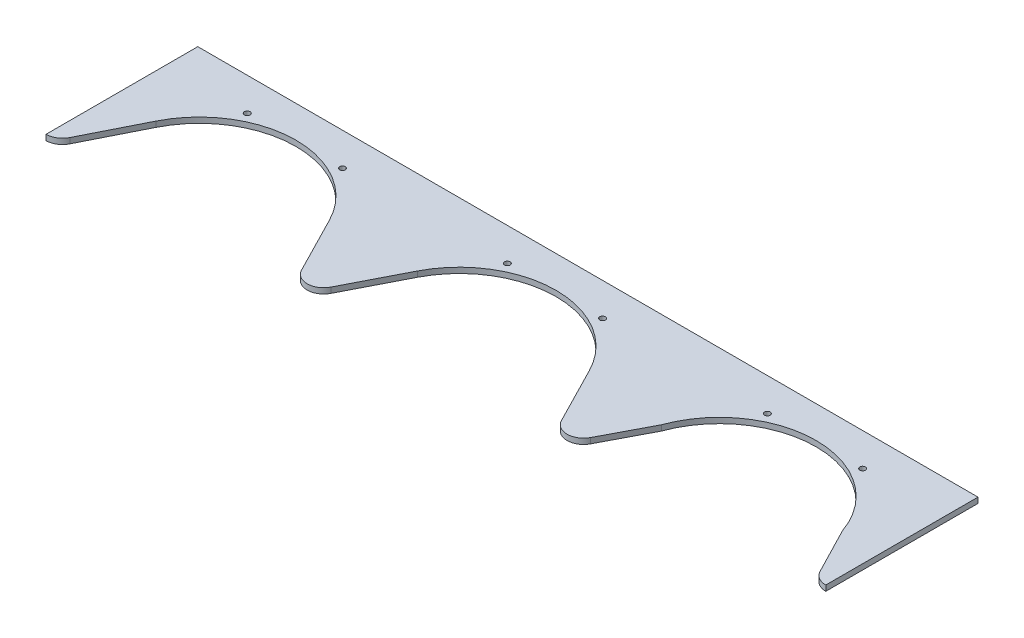
ISO-10303-21;
HEADER;
FILE_DESCRIPTION(('STEP AP214'),'2;1');
FILE_NAME('part.step','',(''),(''),'','','');
FILE_SCHEMA(('AUTOMOTIVE_DESIGN { 1 0 10303 214 1 1 1 1 }'));
ENDSEC;
DATA;
#1=APPLICATION_CONTEXT('core data for automotive mechanical design processes');
#2=APPLICATION_PROTOCOL_DEFINITION('international standard','automotive_design',2000,#1);
#3=PRODUCT_CONTEXT('',#1,'mechanical');
#4=PRODUCT('Part','Part','',(#3));
#5=PRODUCT_RELATED_PRODUCT_CATEGORY('part','',(#4));
#6=PRODUCT_DEFINITION_FORMATION('','',#4);
#7=PRODUCT_DEFINITION_CONTEXT('part definition',#1,'design');
#8=PRODUCT_DEFINITION('design','',#6,#7);
#9=PRODUCT_DEFINITION_SHAPE('','',#8);
#10=(LENGTH_UNIT() NAMED_UNIT(*) SI_UNIT(.MILLI.,.METRE.));
#11=(NAMED_UNIT(*) PLANE_ANGLE_UNIT() SI_UNIT($,.RADIAN.));
#12=(NAMED_UNIT(*) SI_UNIT($,.STERADIAN.) SOLID_ANGLE_UNIT());
#13=UNCERTAINTY_MEASURE_WITH_UNIT(LENGTH_MEASURE(1.E-05),#10,'distance_accuracy_value','');
#14=(GEOMETRIC_REPRESENTATION_CONTEXT(3) GLOBAL_UNCERTAINTY_ASSIGNED_CONTEXT((#13)) GLOBAL_UNIT_ASSIGNED_CONTEXT((#10,
#11,#12)) REPRESENTATION_CONTEXT('',''));
#15=CARTESIAN_POINT('',(0.,0.,0.));
#16=DIRECTION('',(0.,0.,1.));
#17=DIRECTION('',(1.,0.,0.));
#18=AXIS2_PLACEMENT_3D('',#15,#16,#17);
#19=CARTESIAN_POINT('',(-280.073238202378,-3.175,2.62205042113195));
#20=DIRECTION('',(-1.,0.,0.));
#21=DIRECTION('',(0.,0.,1.));
#22=AXIS2_PLACEMENT_3D('',#19,#20,#21);
#23=PLANE('',#22);
#24=DIRECTION('',(0.,0.,1.));
#25=VECTOR('',#24,1.);
#26=CARTESIAN_POINT('',(-280.073238202378,0.,2.62205042113195));
#27=LINE('',#26,#25);
#28=CARTESIAN_POINT('',(-280.073238202378,0.,-62.6015765640897));
#29=VERTEX_POINT('',#28);
#30=CARTESIAN_POINT('',(-280.073238202378,0.,25.1077984359102));
#31=VERTEX_POINT('',#30);
#32=EDGE_CURVE('E225',#29,#31,#27,.T.);
#33=ORIENTED_EDGE('',*,*,#32,.F.);
#34=DIRECTION('',(0.,1.,0.));
#35=VECTOR('',#34,1.);
#36=CARTESIAN_POINT('',(-280.073238202378,-3.175,-62.6015765640897));
#37=LINE('',#36,#35);
#38=CARTESIAN_POINT('',(-280.073238202378,-3.175,-62.6015765640897));
#39=VERTEX_POINT('',#38);
#40=EDGE_CURVE('E171',#39,#29,#37,.T.);
#41=ORIENTED_EDGE('',*,*,#40,.F.);
#42=DIRECTION('',(0.,0.,1.));
#43=VECTOR('',#42,1.);
#44=CARTESIAN_POINT('',(-280.073238202378,-3.175,2.62205042113195));
#45=LINE('',#44,#43);
#46=CARTESIAN_POINT('',(-280.073238202378,-3.175,25.1077984359102));
#47=VERTEX_POINT('',#46);
#48=EDGE_CURVE('E166',#39,#47,#45,.T.);
#49=ORIENTED_EDGE('',*,*,#48,.T.);
#50=DIRECTION('',(0.,1.,0.));
#51=VECTOR('',#50,1.);
#52=CARTESIAN_POINT('',(-280.073238202378,-3.175,25.1077984359102));
#53=LINE('',#52,#51);
#54=EDGE_CURVE('E148',#47,#31,#53,.T.);
#55=ORIENTED_EDGE('',*,*,#54,.T.);
#56=EDGE_LOOP('',(#33,#41,#49,#55));
#57=FACE_BOUND('',#56,.T.);
#58=ADVANCED_FACE('F35',(#57),#23,.T.);
#59=CARTESIAN_POINT('',(-427.444683767428,-3.175,-62.6015765640897));
#60=DIRECTION('',(0.,0.,1.));
#61=DIRECTION('',(1.,0.,0.));
#62=AXIS2_PLACEMENT_3D('',#59,#60,#61);
#63=PLANE('',#62);
#64=DIRECTION('',(1.,0.,0.));
#65=VECTOR('',#64,1.);
#66=CARTESIAN_POINT('',(-427.444683767428,0.,-62.6015765640897));
#67=LINE('',#66,#65);
#68=CARTESIAN_POINT('',(170.776761797622,0.,-62.6015765640897));
#69=VERTEX_POINT('',#68);
#70=EDGE_CURVE('E259',#29,#69,#67,.T.);
#71=ORIENTED_EDGE('',*,*,#70,.T.);
#72=DIRECTION('',(0.,1.,0.));
#73=VECTOR('',#72,1.);
#74=CARTESIAN_POINT('',(170.776761797622,-3.175,-62.6015765640897));
#75=LINE('',#74,#73);
#76=CARTESIAN_POINT('',(170.776761797622,-3.175,-62.6015765640897));
#77=VERTEX_POINT('',#76);
#78=EDGE_CURVE('E276',#77,#69,#75,.T.);
#79=ORIENTED_EDGE('',*,*,#78,.F.);
#80=DIRECTION('',(1.,0.,0.));
#81=VECTOR('',#80,1.);
#82=CARTESIAN_POINT('',(-427.444683767428,-3.175,-62.6015765640897));
#83=LINE('',#82,#81);
#84=EDGE_CURVE('E206',#39,#77,#83,.T.);
#85=ORIENTED_EDGE('',*,*,#84,.F.);
#86=ORIENTED_EDGE('',*,*,#40,.T.);
#87=EDGE_LOOP('',(#71,#79,#85,#86));
#88=FACE_BOUND('',#87,.T.);
#89=ADVANCED_FACE('F328',(#88),#63,.F.);
#90=CARTESIAN_POINT('',(170.776761797622,-3.175,2.62205042113195));
#91=DIRECTION('',(-1.,0.,0.));
#92=DIRECTION('',(0.,0.,1.));
#93=AXIS2_PLACEMENT_3D('',#90,#91,#92);
#94=PLANE('',#93);
#95=DIRECTION('',(0.,0.,1.));
#96=VECTOR('',#95,1.);
#97=CARTESIAN_POINT('',(170.776761797622,0.,2.62205042113195));
#98=LINE('',#97,#96);
#99=CARTESIAN_POINT('',(170.776761797622,0.,25.3727717752158));
#100=VERTEX_POINT('',#99);
#101=EDGE_CURVE('E256',#69,#100,#98,.T.);
#102=ORIENTED_EDGE('',*,*,#101,.T.);
#103=DIRECTION('',(0.,1.,0.));
#104=VECTOR('',#103,1.);
#105=CARTESIAN_POINT('',(170.776761797622,-3.175,25.3727717752158));
#106=LINE('',#105,#104);
#107=CARTESIAN_POINT('',(170.776761797622,-3.175,25.3727717752158));
#108=VERTEX_POINT('',#107);
#109=EDGE_CURVE('E279',#108,#100,#106,.T.);
#110=ORIENTED_EDGE('',*,*,#109,.F.);
#111=DIRECTION('',(0.,0.,1.));
#112=VECTOR('',#111,1.);
#113=CARTESIAN_POINT('',(170.776761797622,-3.175,2.62205042113195));
#114=LINE('',#113,#112);
#115=EDGE_CURVE('E204',#77,#108,#114,.T.);
#116=ORIENTED_EDGE('',*,*,#115,.F.);
#117=ORIENTED_EDGE('',*,*,#78,.T.);
#118=EDGE_LOOP('',(#102,#110,#116,#117));
#119=FACE_BOUND('',#118,.T.);
#120=ADVANCED_FACE('F333',(#119),#94,.F.);
#121=CARTESIAN_POINT('',(170.776761797622,-3.175,15.8477717752158));
#122=DIRECTION('',(0.,1.,0.));
#123=DIRECTION('',(0.,0.,1.));
#124=AXIS2_PLACEMENT_3D('',#121,#122,#123);
#125=CYLINDRICAL_SURFACE('',#124,9.525);
#126=CARTESIAN_POINT('',(170.776761797622,0.,15.8477717752158));
#127=DIRECTION('',(0.,1.,0.));
#128=DIRECTION('',(0.,0.,1.));
#129=AXIS2_PLACEMENT_3D('',#126,#127,#128);
#130=CIRCLE('',#129,9.525);
#131=CARTESIAN_POINT('',(162.31442899308,0.,20.2197905886681));
#132=VERTEX_POINT('',#131);
#133=EDGE_CURVE('E253',#132,#100,#130,.T.);
#134=ORIENTED_EDGE('',*,*,#133,.F.);
#135=DIRECTION('',(0.,1.,0.));
#136=VECTOR('',#135,1.);
#137=CARTESIAN_POINT('',(162.31442899308,-3.175,20.2197905886681));
#138=LINE('',#137,#136);
#139=CARTESIAN_POINT('',(162.31442899308,-3.175,20.2197905886681));
#140=VERTEX_POINT('',#139);
#141=EDGE_CURVE('E281',#140,#132,#138,.T.);
#142=ORIENTED_EDGE('',*,*,#141,.F.);
#143=CARTESIAN_POINT('',(170.776761797622,-3.175,15.8477717752158));
#144=DIRECTION('',(0.,1.,0.));
#145=DIRECTION('',(0.,0.,1.));
#146=AXIS2_PLACEMENT_3D('',#143,#144,#145);
#147=CIRCLE('',#146,9.525);
#148=EDGE_CURVE('E201',#140,#108,#147,.T.);
#149=ORIENTED_EDGE('',*,*,#148,.T.);
#150=ORIENTED_EDGE('',*,*,#109,.T.);
#151=EDGE_LOOP('',(#134,#142,#149,#150));
#152=FACE_BOUND('',#151,.T.);
#153=ADVANCED_FACE('F336',(#152),#125,.T.);
#154=CARTESIAN_POINT('',(30.8846242832344,-3.175,-234.171326043415));
#155=DIRECTION('',(-0.888433890240576,0.,0.459004599837514));
#156=DIRECTION('',(0.459004599837514,0.,0.888433890240576));
#157=AXIS2_PLACEMENT_3D('',#154,#155,#156);
#158=PLANE('',#157);
#159=DIRECTION('',(0.459004599837514,0.,0.888433890240576));
#160=VECTOR('',#159,1.);
#161=CARTESIAN_POINT('',(30.8846242832344,0.,-234.171326043415));
#162=LINE('',#161,#160);
#163=CARTESIAN_POINT('',(148.390090675422,0.,-6.73169108485386));
#164=VERTEX_POINT('',#163);
#165=EDGE_CURVE('E250',#164,#132,#162,.T.);
#166=ORIENTED_EDGE('',*,*,#165,.F.);
#167=DIRECTION('',(0.,1.,0.));
#168=VECTOR('',#167,1.);
#169=CARTESIAN_POINT('',(148.390090675422,-3.175,-6.73169108485386));
#170=LINE('',#169,#168);
#171=CARTESIAN_POINT('',(148.390090675422,-3.175,-6.73169108485386));
#172=VERTEX_POINT('',#171);
#173=EDGE_CURVE('E283',#172,#164,#170,.T.);
#174=ORIENTED_EDGE('',*,*,#173,.F.);
#175=DIRECTION('',(0.459004599837514,0.,0.888433890240576));
#176=VECTOR('',#175,1.);
#177=CARTESIAN_POINT('',(30.8846242832344,-3.175,-234.171326043415));
#178=LINE('',#177,#176);
#179=EDGE_CURVE('E198',#172,#140,#178,.T.);
#180=ORIENTED_EDGE('',*,*,#179,.T.);
#181=ORIENTED_EDGE('',*,*,#141,.T.);
#182=EDGE_LOOP('',(#166,#174,#180,#181));
#183=FACE_BOUND('',#182,.T.);
#184=ADVANCED_FACE('F339',(#183),#158,.T.);
#185=CARTESIAN_POINT('',(95.6350951309553,-3.175,11.6934234359103));
#186=DIRECTION('',(0.,1.,0.));
#187=DIRECTION('',(0.,0.,1.));
#188=AXIS2_PLACEMENT_3D('',#185,#186,#187);
#189=CYLINDRICAL_SURFACE('',#188,55.88);
#190=CARTESIAN_POINT('',(95.6350951309553,0.,11.6934234359103));
#191=DIRECTION('',(0.,1.,0.));
#192=DIRECTION('',(0.,0.,1.));
#193=AXIS2_PLACEMENT_3D('',#190,#191,#192);
#194=CIRCLE('',#193,55.88);
#195=CARTESIAN_POINT('',(43.0891381967172,0.,-7.31964601289768));
#196=VERTEX_POINT('',#195);
#197=EDGE_CURVE('E247',#164,#196,#194,.T.);
#198=ORIENTED_EDGE('',*,*,#197,.T.);
#199=DIRECTION('',(0.,1.,0.));
#200=VECTOR('',#199,1.);
#201=CARTESIAN_POINT('',(43.0891381967172,-3.175,-7.31964601289768));
#202=LINE('',#201,#200);
#203=CARTESIAN_POINT('',(43.0891381967172,-3.175,-7.31964601289768));
#204=VERTEX_POINT('',#203);
#205=EDGE_CURVE('E285',#204,#196,#202,.T.);
#206=ORIENTED_EDGE('',*,*,#205,.F.);
#207=CARTESIAN_POINT('',(95.6350951309553,-3.175,11.6934234359103));
#208=DIRECTION('',(0.,1.,0.));
#209=DIRECTION('',(0.,0.,1.));
#210=AXIS2_PLACEMENT_3D('',#207,#208,#209);
#211=CIRCLE('',#210,55.88);
#212=EDGE_CURVE('E195',#172,#204,#211,.T.);
#213=ORIENTED_EDGE('',*,*,#212,.F.);
#214=ORIENTED_EDGE('',*,*,#173,.T.);
#215=EDGE_LOOP('',(#198,#206,#213,#214));
#216=FACE_BOUND('',#215,.T.);
#217=ADVANCED_FACE('F344',(#216),#189,.F.);
#218=CARTESIAN_POINT('',(-62.2826144303275,-3.175,193.871681693301));
#219=DIRECTION('',(0.885857198551275,0.,0.463957997856365));
#220=DIRECTION('',(0.463957997856365,0.,-0.885857198551275));
#221=AXIS2_PLACEMENT_3D('',#218,#219,#220);
#222=PLANE('',#221);
#223=DIRECTION('',(0.463957997856365,0.,-0.885857198551276));
#224=VECTOR('',#223,1.);
#225=CARTESIAN_POINT('',(-62.2826144303275,0.,193.871681693301));
#226=LINE('',#225,#224);
#227=CARTESIAN_POINT('',(29.0256455147359,0.,19.532453286322));
#228=VERTEX_POINT('',#227);
#229=EDGE_CURVE('E245',#228,#196,#226,.T.);
#230=ORIENTED_EDGE('',*,*,#229,.F.);
#231=DIRECTION('',(0.,1.,0.));
#232=VECTOR('',#231,1.);
#233=CARTESIAN_POINT('',(29.0256455147359,-3.175,19.5324532863221));
#234=LINE('',#233,#232);
#235=CARTESIAN_POINT('',(29.0256455147359,-3.175,19.532453286322));
#236=VERTEX_POINT('',#235);
#237=EDGE_CURVE('E305',#228,#236,#234,.F.);
#238=ORIENTED_EDGE('',*,*,#237,.T.);
#239=DIRECTION('',(0.463957997856365,0.,-0.885857198551276));
#240=VECTOR('',#239,1.);
#241=CARTESIAN_POINT('',(-62.2826144303275,-3.175,193.871681693301));
#242=LINE('',#241,#240);
#243=EDGE_CURVE('E193',#236,#204,#242,.T.);
#244=ORIENTED_EDGE('',*,*,#243,.T.);
#245=ORIENTED_EDGE('',*,*,#205,.T.);
#246=EDGE_LOOP('',(#230,#238,#244,#245));
#247=FACE_BOUND('',#246,.T.);
#248=ADVANCED_FACE('F348',(#247),#222,.T.);
#249=CARTESIAN_POINT('',(-86.0632836712445,-3.175,-172.224546601413));
#250=DIRECTION('',(-0.890051077492998,0.,0.455860811491351));
#251=DIRECTION('',(0.455860811491351,0.,0.890051077492998));
#252=AXIS2_PLACEMENT_3D('',#249,#250,#251);
#253=PLANE('',#252);
#254=DIRECTION('',(0.455860811491351,0.,0.890051077492998));
#255=VECTOR('',#254,1.);
#256=CARTESIAN_POINT('',(-86.0632836712445,-3.175,-172.224546601413));
#257=LINE('',#256,#255);
#258=CARTESIAN_POINT('',(-4.9121839920693,-3.175,-13.7800787102265));
#259=VERTEX_POINT('',#258);
#260=CARTESIAN_POINT('',(12.1101191854142,-3.175,19.4553275861954));
#261=VERTEX_POINT('',#260);
#262=EDGE_CURVE('E190',#259,#261,#257,.T.);
#263=ORIENTED_EDGE('',*,*,#262,.T.);
#264=DIRECTION('',(0.,1.,0.));
#265=VECTOR('',#264,1.);
#266=CARTESIAN_POINT('',(12.1101191854142,-3.175,19.4553275861954));
#267=LINE('',#266,#265);
#268=CARTESIAN_POINT('',(12.1101191854142,0.,19.4553275861954));
#269=VERTEX_POINT('',#268);
#270=EDGE_CURVE('E275',#261,#269,#267,.T.);
#271=ORIENTED_EDGE('',*,*,#270,.T.);
#272=DIRECTION('',(0.455860811491351,0.,0.890051077492998));
#273=VECTOR('',#272,1.);
#274=CARTESIAN_POINT('',(-86.0632836712445,0.,-172.224546601413));
#275=LINE('',#274,#273);
#276=CARTESIAN_POINT('',(-4.9121839920693,0.,-13.7800787102265));
#277=VERTEX_POINT('',#276);
#278=EDGE_CURVE('E242',#277,#269,#275,.T.);
#279=ORIENTED_EDGE('',*,*,#278,.F.);
#280=DIRECTION('',(0.,1.,0.));
#281=VECTOR('',#280,1.);
#282=CARTESIAN_POINT('',(-4.9121839920693,-3.175,-13.7800787102265));
#283=LINE('',#282,#281);
#284=EDGE_CURVE('E288',#259,#277,#283,.T.);
#285=ORIENTED_EDGE('',*,*,#284,.F.);
#286=EDGE_LOOP('',(#263,#271,#279,#285));
#287=FACE_BOUND('',#286,.T.);
#288=ADVANCED_FACE('F355',(#287),#253,.T.);
#289=CARTESIAN_POINT('',(-54.6482382023781,-3.175,11.6934234359103));
#290=DIRECTION('',(0.,1.,0.));
#291=DIRECTION('',(0.,0.,1.));
#292=AXIS2_PLACEMENT_3D('',#289,#290,#291);
#293=CYLINDRICAL_SURFACE('',#292,55.88);
#294=CARTESIAN_POINT('',(-54.6482382023781,0.,11.6934234359103));
#295=DIRECTION('',(0.,1.,0.));
#296=DIRECTION('',(0.,0.,1.));
#297=AXIS2_PLACEMENT_3D('',#294,#295,#296);
#298=CIRCLE('',#297,55.88);
#299=CARTESIAN_POINT('',(-104.384292412687,0.,-13.7800787102265));
#300=VERTEX_POINT('',#299);
#301=EDGE_CURVE('E239',#277,#300,#298,.T.);
#302=ORIENTED_EDGE('',*,*,#301,.T.);
#303=DIRECTION('',(0.,1.,0.));
#304=VECTOR('',#303,1.);
#305=CARTESIAN_POINT('',(-104.384292412687,-3.175,-13.7800787102265));
#306=LINE('',#305,#304);
#307=CARTESIAN_POINT('',(-104.384292412687,-3.175,-13.7800787102265));
#308=VERTEX_POINT('',#307);
#309=EDGE_CURVE('E290',#308,#300,#306,.T.);
#310=ORIENTED_EDGE('',*,*,#309,.F.);
#311=CARTESIAN_POINT('',(-54.6482382023781,-3.175,11.6934234359103));
#312=DIRECTION('',(0.,1.,0.));
#313=DIRECTION('',(0.,0.,1.));
#314=AXIS2_PLACEMENT_3D('',#311,#312,#313);
#315=CIRCLE('',#314,55.88);
#316=EDGE_CURVE('E187',#259,#308,#315,.T.);
#317=ORIENTED_EDGE('',*,*,#316,.F.);
#318=ORIENTED_EDGE('',*,*,#284,.T.);
#319=EDGE_LOOP('',(#302,#310,#317,#318));
#320=FACE_BOUND('',#319,.T.);
#321=ADVANCED_FACE('F361',(#320),#293,.F.);
#322=CARTESIAN_POINT('',(-178.174165086371,-3.175,130.291870502565));
#323=DIRECTION('',(0.890051077492997,0.,0.455860811491352));
#324=DIRECTION('',(0.455860811491352,0.,-0.890051077492997));
#325=AXIS2_PLACEMENT_3D('',#322,#323,#324);
#326=PLANE('',#325);
#327=DIRECTION('',(0.455860811491352,0.,-0.890051077492997));
#328=VECTOR('',#327,1.);
#329=CARTESIAN_POINT('',(-178.174165086371,0.,130.291870502565));
#330=LINE('',#329,#328);
#331=CARTESIAN_POINT('',(-121.312168355924,0.,19.2709619652273));
#332=VERTEX_POINT('',#331);
#333=EDGE_CURVE('E237',#332,#300,#330,.T.);
#334=ORIENTED_EDGE('',*,*,#333,.F.);
#335=DIRECTION('',(0.,1.,0.));
#336=VECTOR('',#335,1.);
#337=CARTESIAN_POINT('',(-121.312168355924,-3.175,19.2709619652274));
#338=LINE('',#337,#336);
#339=CARTESIAN_POINT('',(-121.312168355924,-3.175,19.2709619652273));
#340=VERTEX_POINT('',#339);
#341=EDGE_CURVE('E11',#332,#340,#338,.F.);
#342=ORIENTED_EDGE('',*,*,#341,.T.);
#343=DIRECTION('',(0.455860811491352,0.,-0.890051077492997));
#344=VECTOR('',#343,1.);
#345=CARTESIAN_POINT('',(-178.174165086371,-3.175,130.291870502565));
#346=LINE('',#345,#344);
#347=EDGE_CURVE('E185',#340,#308,#346,.T.);
#348=ORIENTED_EDGE('',*,*,#347,.T.);
#349=ORIENTED_EDGE('',*,*,#309,.T.);
#350=EDGE_LOOP('',(#334,#342,#348,#349));
#351=FACE_BOUND('',#350,.T.);
#352=ADVANCED_FACE('F430',(#351),#326,.T.);
#353=CARTESIAN_POINT('',(-205.116375847367,-3.175,-111.248676134711));
#354=DIRECTION('',(-0.890051077492998,0.,0.455860811491352));
#355=DIRECTION('',(0.455860811491352,0.,0.890051077492998));
#356=AXIS2_PLACEMENT_3D('',#353,#354,#355);
#357=PLANE('',#356);
#358=DIRECTION('',(0.455860811491352,0.,0.890051077492998));
#359=VECTOR('',#358,1.);
#360=CARTESIAN_POINT('',(-205.116375847367,-3.175,-111.248676134711));
#361=LINE('',#360,#359);
#362=CARTESIAN_POINT('',(-155.195517325403,-3.175,-13.7800787102264));
#363=VERTEX_POINT('',#362);
#364=CARTESIAN_POINT('',(-138.267641382166,-3.175,19.2709619652273));
#365=VERTEX_POINT('',#364);
#366=EDGE_CURVE('E183',#363,#365,#361,.T.);
#367=ORIENTED_EDGE('',*,*,#366,.T.);
#368=DIRECTION('',(0.,1.,0.));
#369=VECTOR('',#368,1.);
#370=CARTESIAN_POINT('',(-138.267641382166,-3.175,19.2709619652273));
#371=LINE('',#370,#369);
#372=CARTESIAN_POINT('',(-138.267641382166,0.,19.2709619652273));
#373=VERTEX_POINT('',#372);
#374=EDGE_CURVE('E43',#365,#373,#371,.T.);
#375=ORIENTED_EDGE('',*,*,#374,.T.);
#376=DIRECTION('',(0.455860811491352,0.,0.890051077492998));
#377=VECTOR('',#376,1.);
#378=CARTESIAN_POINT('',(-205.116375847367,0.,-111.248676134711));
#379=LINE('',#378,#377);
#380=CARTESIAN_POINT('',(-155.195517325403,0.,-13.7800787102264));
#381=VERTEX_POINT('',#380);
#382=EDGE_CURVE('E234',#381,#373,#379,.T.);
#383=ORIENTED_EDGE('',*,*,#382,.F.);
#384=DIRECTION('',(0.,1.,0.));
#385=VECTOR('',#384,1.);
#386=CARTESIAN_POINT('',(-155.195517325403,-3.175,-13.7800787102264));
#387=LINE('',#386,#385);
#388=EDGE_CURVE('E293',#363,#381,#387,.T.);
#389=ORIENTED_EDGE('',*,*,#388,.F.);
#390=EDGE_LOOP('',(#367,#375,#383,#389));
#391=FACE_BOUND('',#390,.T.);
#392=ADVANCED_FACE('F313',(#391),#357,.T.);
#393=CARTESIAN_POINT('',(-204.931571535711,-3.175,11.6934234359103));
#394=DIRECTION('',(0.,1.,0.));
#395=DIRECTION('',(0.,0.,1.));
#396=AXIS2_PLACEMENT_3D('',#393,#394,#395);
#397=CYLINDRICAL_SURFACE('',#396,55.88);
#398=CARTESIAN_POINT('',(-204.931571535711,0.,11.6934234359103));
#399=DIRECTION('',(0.,1.,0.));
#400=DIRECTION('',(0.,0.,1.));
#401=AXIS2_PLACEMENT_3D('',#398,#399,#400);
#402=CIRCLE('',#401,55.88);
#403=CARTESIAN_POINT('',(-254.86877631085,0.,-13.3834579341069));
#404=VERTEX_POINT('',#403);
#405=EDGE_CURVE('E231',#381,#404,#402,.T.);
#406=ORIENTED_EDGE('',*,*,#405,.T.);
#407=DIRECTION('',(0.,1.,0.));
#408=VECTOR('',#407,1.);
#409=CARTESIAN_POINT('',(-254.86877631085,-3.175,-13.3834579341069));
#410=LINE('',#409,#408);
#411=CARTESIAN_POINT('',(-254.86877631085,-3.175,-13.3834579341069));
#412=VERTEX_POINT('',#411);
#413=EDGE_CURVE('E295',#412,#404,#410,.T.);
#414=ORIENTED_EDGE('',*,*,#413,.F.);
#415=CARTESIAN_POINT('',(-204.931571535711,-3.175,11.6934234359103));
#416=DIRECTION('',(0.,1.,0.));
#417=DIRECTION('',(0.,0.,1.));
#418=AXIS2_PLACEMENT_3D('',#415,#416,#417);
#419=CIRCLE('',#418,55.88);
#420=EDGE_CURVE('E181',#363,#412,#419,.T.);
#421=ORIENTED_EDGE('',*,*,#420,.F.);
#422=ORIENTED_EDGE('',*,*,#388,.T.);
#423=EDGE_LOOP('',(#406,#414,#421,#422));
#424=FACE_BOUND('',#423,.T.);
#425=ADVANCED_FACE('F321',(#424),#397,.F.);
#426=CARTESIAN_POINT('',(-296.042355242531,-3.175,68.6081347244211));
#427=DIRECTION('',(-0.893650765482072,0.,-0.448763088225074));
#428=DIRECTION('',(-0.448763088225075,0.,0.893650765482073));
#429=AXIS2_PLACEMENT_3D('',#426,#427,#428);
#430=PLANE('',#429);
#431=DIRECTION('',(-0.448763088225075,0.,0.893650765482072));
#432=VECTOR('',#431,1.);
#433=CARTESIAN_POINT('',(-296.042355242531,0.,68.6081347244211));
#434=LINE('',#433,#432);
#435=CARTESIAN_POINT('',(-271.561214661161,0.,19.8572668512541));
#436=VERTEX_POINT('',#435);
#437=EDGE_CURVE('E228',#404,#436,#434,.T.);
#438=ORIENTED_EDGE('',*,*,#437,.T.);
#439=DIRECTION('',(0.,1.,0.));
#440=VECTOR('',#439,1.);
#441=CARTESIAN_POINT('',(-271.561214661161,-3.175,19.8572668512541));
#442=LINE('',#441,#440);
#443=CARTESIAN_POINT('',(-271.561214661161,-3.175,19.8572668512541));
#444=VERTEX_POINT('',#443);
#445=EDGE_CURVE('E158',#444,#436,#442,.T.);
#446=ORIENTED_EDGE('',*,*,#445,.F.);
#447=DIRECTION('',(-0.448763088225075,0.,0.893650765482072));
#448=VECTOR('',#447,1.);
#449=CARTESIAN_POINT('',(-296.042355242531,-3.175,68.6081347244211));
#450=LINE('',#449,#448);
#451=EDGE_CURVE('E168',#412,#444,#450,.T.);
#452=ORIENTED_EDGE('',*,*,#451,.F.);
#453=ORIENTED_EDGE('',*,*,#413,.T.);
#454=EDGE_LOOP('',(#438,#446,#452,#453));
#455=FACE_BOUND('',#454,.T.);
#456=ADVANCED_FACE('F324',(#455),#430,.F.);
#457=CARTESIAN_POINT('',(123.143295130955,-3.175,-43.5515765640897));
#458=DIRECTION('',(0.,1.,0.));
#459=DIRECTION('',(0.,0.,1.));
#460=AXIS2_PLACEMENT_3D('',#457,#458,#459);
#461=CYLINDRICAL_SURFACE('',#460,1.63830000000002);
#462=CARTESIAN_POINT('',(123.143295130955,-3.175,-43.5515765640897));
#463=DIRECTION('',(0.,1.,0.));
#464=DIRECTION('',(0.,0.,1.));
#465=AXIS2_PLACEMENT_3D('',#462,#463,#464);
#466=CIRCLE('',#465,1.63830000000002);
#467=CARTESIAN_POINT('',(123.143295130955,-3.175,-41.9132765640897));
#468=VERTEX_POINT('',#467);
#469=EDGE_CURVE('E214',#468,#468,#466,.T.);
#470=ORIENTED_EDGE('',*,*,#469,.F.);
#471=EDGE_LOOP('',(#470));
#472=FACE_BOUND('',#471,.T.);
#473=CARTESIAN_POINT('',(123.143295130955,0.,-43.5515765640897));
#474=DIRECTION('',(0.,1.,0.));
#475=DIRECTION('',(0.,0.,1.));
#476=AXIS2_PLACEMENT_3D('',#473,#474,#475);
#477=CIRCLE('',#476,1.63830000000002);
#478=CARTESIAN_POINT('',(123.143295130955,0.,-41.9132765640897));
#479=VERTEX_POINT('',#478);
#480=EDGE_CURVE('E268',#479,#479,#477,.T.);
#481=ORIENTED_EDGE('',*,*,#480,.T.);
#482=EDGE_LOOP('',(#481));
#483=FACE_BOUND('',#482,.T.);
#484=ADVANCED_FACE('F404',(#472,#483),#461,.F.);
#485=CARTESIAN_POINT('',(-82.1564382023781,-3.175,-43.5515765640897));
#486=DIRECTION('',(0.,1.,0.));
#487=DIRECTION('',(0.,0.,1.));
#488=AXIS2_PLACEMENT_3D('',#485,#486,#487);
#489=CYLINDRICAL_SURFACE('',#488,1.63829999999999);
#490=CARTESIAN_POINT('',(-82.1564382023781,-3.175,-43.5515765640897));
#491=DIRECTION('',(0.,1.,0.));
#492=DIRECTION('',(0.,0.,1.));
#493=AXIS2_PLACEMENT_3D('',#490,#491,#492);
#494=CIRCLE('',#493,1.63829999999999);
#495=CARTESIAN_POINT('',(-82.1564382023781,-3.175,-41.9132765640897));
#496=VERTEX_POINT('',#495);
#497=EDGE_CURVE('E211',#496,#496,#494,.T.);
#498=ORIENTED_EDGE('',*,*,#497,.F.);
#499=EDGE_LOOP('',(#498));
#500=FACE_BOUND('',#499,.T.);
#501=CARTESIAN_POINT('',(-82.1564382023781,0.,-43.5515765640897));
#502=DIRECTION('',(0.,1.,0.));
#503=DIRECTION('',(0.,0.,1.));
#504=AXIS2_PLACEMENT_3D('',#501,#502,#503);
#505=CIRCLE('',#504,1.63829999999999);
#506=CARTESIAN_POINT('',(-82.1564382023781,0.,-41.9132765640897));
#507=VERTEX_POINT('',#506);
#508=EDGE_CURVE('E265',#507,#507,#505,.T.);
#509=ORIENTED_EDGE('',*,*,#508,.T.);
#510=EDGE_LOOP('',(#509));
#511=FACE_BOUND('',#510,.T.);
#512=ADVANCED_FACE('F407',(#500,#511),#489,.F.);
#513=CARTESIAN_POINT('',(-27.1400382023781,-3.175,-43.5515765640897));
#514=DIRECTION('',(0.,1.,0.));
#515=DIRECTION('',(0.,0.,1.));
#516=AXIS2_PLACEMENT_3D('',#513,#514,#515);
#517=CYLINDRICAL_SURFACE('',#516,1.63829999999999);
#518=CARTESIAN_POINT('',(-27.1400382023781,-3.175,-43.5515765640897));
#519=DIRECTION('',(0.,1.,0.));
#520=DIRECTION('',(0.,0.,1.));
#521=AXIS2_PLACEMENT_3D('',#518,#519,#520);
#522=CIRCLE('',#521,1.63829999999999);
#523=CARTESIAN_POINT('',(-27.1400382023781,-3.175,-41.9132765640897));
#524=VERTEX_POINT('',#523);
#525=EDGE_CURVE('E208',#524,#524,#522,.T.);
#526=ORIENTED_EDGE('',*,*,#525,.F.);
#527=EDGE_LOOP('',(#526));
#528=FACE_BOUND('',#527,.T.);
#529=CARTESIAN_POINT('',(-27.1400382023781,0.,-43.5515765640897));
#530=DIRECTION('',(0.,1.,0.));
#531=DIRECTION('',(0.,0.,1.));
#532=AXIS2_PLACEMENT_3D('',#529,#530,#531);
#533=CIRCLE('',#532,1.63829999999999);
#534=CARTESIAN_POINT('',(-27.1400382023781,0.,-41.9132765640897));
#535=VERTEX_POINT('',#534);
#536=EDGE_CURVE('E262',#535,#535,#533,.T.);
#537=ORIENTED_EDGE('',*,*,#536,.T.);
#538=EDGE_LOOP('',(#537));
#539=FACE_BOUND('',#538,.T.);
#540=ADVANCED_FACE('F411',(#528,#539),#517,.F.);
#541=CARTESIAN_POINT('',(-280.073238202378,-3.175,15.5827984359102));
#542=DIRECTION('',(0.,1.,0.));
#543=DIRECTION('',(0.,0.,1.));
#544=AXIS2_PLACEMENT_3D('',#541,#542,#543);
#545=CYLINDRICAL_SURFACE('',#544,9.52500000000002);
#546=CARTESIAN_POINT('',(-280.073238202378,0.,15.5827984359102));
#547=DIRECTION('',(0.,1.,0.));
#548=DIRECTION('',(0.,0.,1.));
#549=AXIS2_PLACEMENT_3D('',#546,#547,#548);
#550=CIRCLE('',#549,9.52500000000002);
#551=EDGE_CURVE('E153',#31,#436,#550,.T.);
#552=ORIENTED_EDGE('',*,*,#551,.F.);
#553=ORIENTED_EDGE('',*,*,#54,.F.);
#554=CARTESIAN_POINT('',(-280.073238202378,-3.175,15.5827984359102));
#555=DIRECTION('',(0.,1.,0.));
#556=DIRECTION('',(0.,0.,1.));
#557=AXIS2_PLACEMENT_3D('',#554,#555,#556);
#558=CIRCLE('',#557,9.52500000000002);
#559=EDGE_CURVE('E151',#47,#444,#558,.T.);
#560=ORIENTED_EDGE('',*,*,#559,.T.);
#561=ORIENTED_EDGE('',*,*,#445,.T.);
#562=EDGE_LOOP('',(#552,#553,#560,#561));
#563=FACE_BOUND('',#562,.T.);
#564=ADVANCED_FACE('F150',(#563),#545,.T.);
#565=CARTESIAN_POINT('',(-232.439771535711,-3.175,-43.5515765640897));
#566=DIRECTION('',(0.,1.,0.));
#567=DIRECTION('',(0.,0.,1.));
#568=AXIS2_PLACEMENT_3D('',#565,#566,#567);
#569=CYLINDRICAL_SURFACE('',#568,1.63830000000002);
#570=CARTESIAN_POINT('',(-232.439771535711,-3.175,-43.5515765640897));
#571=DIRECTION('',(0.,1.,0.));
#572=DIRECTION('',(0.,0.,1.));
#573=AXIS2_PLACEMENT_3D('',#570,#571,#572);
#574=CIRCLE('',#573,1.63830000000002);
#575=CARTESIAN_POINT('',(-232.439771535711,-3.175,-41.9132765640897));
#576=VERTEX_POINT('',#575);
#577=EDGE_CURVE('E173',#576,#576,#574,.T.);
#578=ORIENTED_EDGE('',*,*,#577,.F.);
#579=EDGE_LOOP('',(#578));
#580=FACE_BOUND('',#579,.T.);
#581=CARTESIAN_POINT('',(-232.439771535711,0.,-43.5515765640897));
#582=DIRECTION('',(0.,1.,0.));
#583=DIRECTION('',(0.,0.,1.));
#584=AXIS2_PLACEMENT_3D('',#581,#582,#583);
#585=CIRCLE('',#584,1.63830000000002);
#586=CARTESIAN_POINT('',(-232.439771535711,0.,-41.9132765640897));
#587=VERTEX_POINT('',#586);
#588=EDGE_CURVE('E222',#587,#587,#585,.T.);
#589=ORIENTED_EDGE('',*,*,#588,.T.);
#590=EDGE_LOOP('',(#589));
#591=FACE_BOUND('',#590,.T.);
#592=ADVANCED_FACE('F375',(#580,#591),#569,.F.);
#593=CARTESIAN_POINT('',(-177.423371535711,-3.175,-43.5515765640897));
#594=DIRECTION('',(0.,1.,0.));
#595=DIRECTION('',(0.,0.,1.));
#596=AXIS2_PLACEMENT_3D('',#593,#594,#595);
#597=CYLINDRICAL_SURFACE('',#596,1.63830000000002);
#598=CARTESIAN_POINT('',(-177.423371535711,-3.175,-43.5515765640897));
#599=DIRECTION('',(0.,1.,0.));
#600=DIRECTION('',(0.,0.,1.));
#601=AXIS2_PLACEMENT_3D('',#598,#599,#600);
#602=CIRCLE('',#601,1.63830000000002);
#603=CARTESIAN_POINT('',(-177.423371535711,-3.175,-41.9132765640897));
#604=VERTEX_POINT('',#603);
#605=EDGE_CURVE('E176',#604,#604,#602,.T.);
#606=ORIENTED_EDGE('',*,*,#605,.F.);
#607=EDGE_LOOP('',(#606));
#608=FACE_BOUND('',#607,.T.);
#609=CARTESIAN_POINT('',(-177.423371535711,0.,-43.5515765640897));
#610=DIRECTION('',(0.,1.,0.));
#611=DIRECTION('',(0.,0.,1.));
#612=AXIS2_PLACEMENT_3D('',#609,#610,#611);
#613=CIRCLE('',#612,1.63830000000002);
#614=CARTESIAN_POINT('',(-177.423371535711,0.,-41.9132765640897));
#615=VERTEX_POINT('',#614);
#616=EDGE_CURVE('E219',#615,#615,#613,.T.);
#617=ORIENTED_EDGE('',*,*,#616,.T.);
#618=EDGE_LOOP('',(#617));
#619=FACE_BOUND('',#618,.T.);
#620=ADVANCED_FACE('F378',(#608,#619),#597,.F.);
#621=CARTESIAN_POINT('',(68.1268951309552,-3.175,-43.5515765640897));
#622=DIRECTION('',(0.,1.,0.));
#623=DIRECTION('',(0.,0.,1.));
#624=AXIS2_PLACEMENT_3D('',#621,#622,#623);
#625=CYLINDRICAL_SURFACE('',#624,1.63829999999999);
#626=CARTESIAN_POINT('',(68.1268951309552,-3.175,-43.5515765640897));
#627=DIRECTION('',(0.,1.,0.));
#628=DIRECTION('',(0.,0.,1.));
#629=AXIS2_PLACEMENT_3D('',#626,#627,#628);
#630=CIRCLE('',#629,1.63829999999999);
#631=CARTESIAN_POINT('',(68.1268951309552,-3.175,-41.9132765640897));
#632=VERTEX_POINT('',#631);
#633=EDGE_CURVE('E159',#632,#632,#630,.T.);
#634=ORIENTED_EDGE('',*,*,#633,.F.);
#635=EDGE_LOOP('',(#634));
#636=FACE_BOUND('',#635,.T.);
#637=CARTESIAN_POINT('',(68.1268951309552,0.,-43.5515765640897));
#638=DIRECTION('',(0.,1.,0.));
#639=DIRECTION('',(0.,0.,1.));
#640=AXIS2_PLACEMENT_3D('',#637,#638,#639);
#641=CIRCLE('',#640,1.63829999999999);
#642=CARTESIAN_POINT('',(68.1268951309552,0.,-41.9132765640897));
#643=VERTEX_POINT('',#642);
#644=EDGE_CURVE('E271',#643,#643,#641,.T.);
#645=ORIENTED_EDGE('',*,*,#644,.T.);
#646=EDGE_LOOP('',(#645));
#647=FACE_BOUND('',#646,.T.);
#648=ADVANCED_FACE('F381',(#636,#647),#625,.F.);
#649=CARTESIAN_POINT('',(-427.444683767428,-3.175,2.62205042113195));
#650=DIRECTION('',(0.,1.,0.));
#651=DIRECTION('',(0.,0.,1.));
#652=AXIS2_PLACEMENT_3D('',#649,#650,#651);
#653=PLANE('',#652);
#654=ORIENTED_EDGE('',*,*,#605,.T.);
#655=EDGE_LOOP('',(#654));
#656=FACE_BOUND('',#655,.T.);
#657=ORIENTED_EDGE('',*,*,#577,.T.);
#658=EDGE_LOOP('',(#657));
#659=FACE_BOUND('',#658,.T.);
#660=ORIENTED_EDGE('',*,*,#243,.F.);
#661=CARTESIAN_POINT('',(20.587855698535,-3.175,15.1132533567402));
#662=DIRECTION('',(0.,1.,0.));
#663=DIRECTION('',(0.,0.,1.));
#664=AXIS2_PLACEMENT_3D('',#661,#662,#663);
#665=CIRCLE('',#664,9.525);
#666=EDGE_CURVE('E308',#236,#261,#665,.F.);
#667=ORIENTED_EDGE('',*,*,#666,.T.);
#668=ORIENTED_EDGE('',*,*,#262,.F.);
#669=ORIENTED_EDGE('',*,*,#316,.T.);
#670=ORIENTED_EDGE('',*,*,#347,.F.);
#671=CARTESIAN_POINT('',(-129.789904869045,-3.175,14.9288877357722));
#672=DIRECTION('',(0.,1.,0.));
#673=DIRECTION('',(0.,0.,1.));
#674=AXIS2_PLACEMENT_3D('',#671,#672,#673);
#675=CIRCLE('',#674,9.525);
#676=EDGE_CURVE('E50',#340,#365,#675,.F.);
#677=ORIENTED_EDGE('',*,*,#676,.T.);
#678=ORIENTED_EDGE('',*,*,#366,.F.);
#679=ORIENTED_EDGE('',*,*,#420,.T.);
#680=ORIENTED_EDGE('',*,*,#451,.T.);
#681=ORIENTED_EDGE('',*,*,#559,.F.);
#682=ORIENTED_EDGE('',*,*,#48,.F.);
#683=ORIENTED_EDGE('',*,*,#84,.T.);
#684=ORIENTED_EDGE('',*,*,#115,.T.);
#685=ORIENTED_EDGE('',*,*,#148,.F.);
#686=ORIENTED_EDGE('',*,*,#179,.F.);
#687=ORIENTED_EDGE('',*,*,#212,.T.);
#688=EDGE_LOOP('',(#660,#667,#668,#669,#670,#677,#678,#679,#680,#681,#682,#683,#684,#685,#686,#687));
#689=FACE_BOUND('',#688,.T.);
#690=ORIENTED_EDGE('',*,*,#525,.T.);
#691=EDGE_LOOP('',(#690));
#692=FACE_BOUND('',#691,.T.);
#693=ORIENTED_EDGE('',*,*,#497,.T.);
#694=EDGE_LOOP('',(#693));
#695=FACE_BOUND('',#694,.T.);
#696=ORIENTED_EDGE('',*,*,#469,.T.);
#697=EDGE_LOOP('',(#696));
#698=FACE_BOUND('',#697,.T.);
#699=ORIENTED_EDGE('',*,*,#633,.T.);
#700=EDGE_LOOP('',(#699));
#701=FACE_BOUND('',#700,.T.);
#702=ADVANCED_FACE('F163',(#656,#659,#689,#692,#695,#698,#701),#653,.F.);
#703=CARTESIAN_POINT('',(-427.444683767428,0.,2.62205042113195));
#704=DIRECTION('',(0.,1.,0.));
#705=DIRECTION('',(0.,0.,1.));
#706=AXIS2_PLACEMENT_3D('',#703,#704,#705);
#707=PLANE('',#706);
#708=ORIENTED_EDGE('',*,*,#616,.F.);
#709=EDGE_LOOP('',(#708));
#710=FACE_BOUND('',#709,.T.);
#711=ORIENTED_EDGE('',*,*,#588,.F.);
#712=EDGE_LOOP('',(#711));
#713=FACE_BOUND('',#712,.T.);
#714=ORIENTED_EDGE('',*,*,#278,.T.);
#715=CARTESIAN_POINT('',(20.587855698535,0.,15.1132533567402));
#716=DIRECTION('',(0.,1.,0.));
#717=DIRECTION('',(0.,0.,1.));
#718=AXIS2_PLACEMENT_3D('',#715,#716,#717);
#719=CIRCLE('',#718,9.525);
#720=EDGE_CURVE('E303',#269,#228,#719,.T.);
#721=ORIENTED_EDGE('',*,*,#720,.T.);
#722=ORIENTED_EDGE('',*,*,#229,.T.);
#723=ORIENTED_EDGE('',*,*,#197,.F.);
#724=ORIENTED_EDGE('',*,*,#165,.T.);
#725=ORIENTED_EDGE('',*,*,#133,.T.);
#726=ORIENTED_EDGE('',*,*,#101,.F.);
#727=ORIENTED_EDGE('',*,*,#70,.F.);
#728=ORIENTED_EDGE('',*,*,#32,.T.);
#729=ORIENTED_EDGE('',*,*,#551,.T.);
#730=ORIENTED_EDGE('',*,*,#437,.F.);
#731=ORIENTED_EDGE('',*,*,#405,.F.);
#732=ORIENTED_EDGE('',*,*,#382,.T.);
#733=CARTESIAN_POINT('',(-129.789904869045,0.,14.9288877357722));
#734=DIRECTION('',(0.,1.,0.));
#735=DIRECTION('',(0.,0.,1.));
#736=AXIS2_PLACEMENT_3D('',#733,#734,#735);
#737=CIRCLE('',#736,9.525);
#738=EDGE_CURVE('E301',#373,#332,#737,.T.);
#739=ORIENTED_EDGE('',*,*,#738,.T.);
#740=ORIENTED_EDGE('',*,*,#333,.T.);
#741=ORIENTED_EDGE('',*,*,#301,.F.);
#742=EDGE_LOOP('',(#714,#721,#722,#723,#724,#725,#726,#727,#728,#729,#730,#731,#732,#739,#740,#741));
#743=FACE_BOUND('',#742,.T.);
#744=ORIENTED_EDGE('',*,*,#536,.F.);
#745=EDGE_LOOP('',(#744));
#746=FACE_BOUND('',#745,.T.);
#747=ORIENTED_EDGE('',*,*,#508,.F.);
#748=EDGE_LOOP('',(#747));
#749=FACE_BOUND('',#748,.T.);
#750=ORIENTED_EDGE('',*,*,#480,.F.);
#751=EDGE_LOOP('',(#750));
#752=FACE_BOUND('',#751,.T.);
#753=ORIENTED_EDGE('',*,*,#644,.F.);
#754=EDGE_LOOP('',(#753));
#755=FACE_BOUND('',#754,.T.);
#756=ADVANCED_FACE('F317',(#710,#713,#743,#746,#749,#752,#755),#707,.T.);
#757=CARTESIAN_POINT('',(20.587855698535,-3.175,15.1132533567402));
#758=DIRECTION('',(0.,1.,0.));
#759=DIRECTION('',(0.,0.,1.));
#760=AXIS2_PLACEMENT_3D('',#757,#758,#759);
#761=CYLINDRICAL_SURFACE('',#760,9.525);
#762=ORIENTED_EDGE('',*,*,#666,.F.);
#763=ORIENTED_EDGE('',*,*,#237,.F.);
#764=ORIENTED_EDGE('',*,*,#720,.F.);
#765=ORIENTED_EDGE('',*,*,#270,.F.);
#766=EDGE_LOOP('',(#762,#763,#764,#765));
#767=FACE_BOUND('',#766,.T.);
#768=ADVANCED_FACE('F351',(#767),#761,.T.);
#769=CARTESIAN_POINT('',(-129.789904869045,-3.175,14.9288877357722));
#770=DIRECTION('',(0.,1.,0.));
#771=DIRECTION('',(0.,0.,1.));
#772=AXIS2_PLACEMENT_3D('',#769,#770,#771);
#773=CYLINDRICAL_SURFACE('',#772,9.525);
#774=ORIENTED_EDGE('',*,*,#676,.F.);
#775=ORIENTED_EDGE('',*,*,#341,.F.);
#776=ORIENTED_EDGE('',*,*,#738,.F.);
#777=ORIENTED_EDGE('',*,*,#374,.F.);
#778=EDGE_LOOP('',(#774,#775,#776,#777));
#779=FACE_BOUND('',#778,.T.);
#780=ADVANCED_FACE('F37',(#779),#773,.T.);
#781=CLOSED_SHELL('',(#58,#89,#120,#153,#184,#217,#248,#288,#321,#352,#392,#425,#456,#484,#512,
#540,#564,#592,#620,#648,#702,#756,#768,#780));
#782=MANIFOLD_SOLID_BREP('B2',#781);
#783=ADVANCED_BREP_SHAPE_REPRESENTATION('',(#18,#782),#14);
#784=SHAPE_DEFINITION_REPRESENTATION(#9,#783);
ENDSEC;
END-ISO-10303-21;
